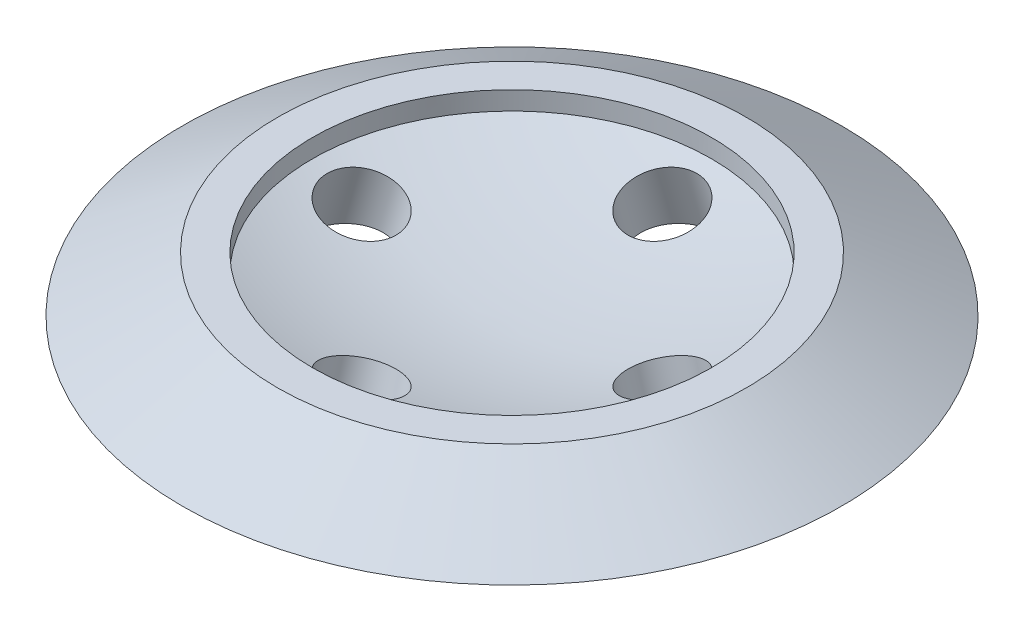
ISO-10303-21;
HEADER;
FILE_DESCRIPTION(('STEP AP214'),'2;1');
FILE_NAME('part.step','',(''),(''),'','','');
FILE_SCHEMA(('AUTOMOTIVE_DESIGN { 1 0 10303 214 1 1 1 1 }'));
ENDSEC;
DATA;
#1=APPLICATION_CONTEXT('core data for automotive mechanical design processes');
#2=APPLICATION_PROTOCOL_DEFINITION('international standard','automotive_design',2000,#1);
#3=PRODUCT_CONTEXT('',#1,'mechanical');
#4=PRODUCT('Part','Part','',(#3));
#5=PRODUCT_RELATED_PRODUCT_CATEGORY('part','',(#4));
#6=PRODUCT_DEFINITION_FORMATION('','',#4);
#7=PRODUCT_DEFINITION_CONTEXT('part definition',#1,'design');
#8=PRODUCT_DEFINITION('design','',#6,#7);
#9=PRODUCT_DEFINITION_SHAPE('','',#8);
#10=(LENGTH_UNIT() NAMED_UNIT(*) SI_UNIT(.MILLI.,.METRE.));
#11=(NAMED_UNIT(*) PLANE_ANGLE_UNIT() SI_UNIT($,.RADIAN.));
#12=(NAMED_UNIT(*) SI_UNIT($,.STERADIAN.) SOLID_ANGLE_UNIT());
#13=UNCERTAINTY_MEASURE_WITH_UNIT(LENGTH_MEASURE(1.E-05),#10,'distance_accuracy_value','');
#14=(GEOMETRIC_REPRESENTATION_CONTEXT(3) GLOBAL_UNCERTAINTY_ASSIGNED_CONTEXT((#13)) GLOBAL_UNIT_ASSIGNED_CONTEXT((#10,
#11,#12)) REPRESENTATION_CONTEXT('',''));
#15=CARTESIAN_POINT('',(0.,0.,0.));
#16=DIRECTION('',(0.,0.,1.));
#17=DIRECTION('',(1.,0.,0.));
#18=AXIS2_PLACEMENT_3D('',#15,#16,#17);
#19=CARTESIAN_POINT('',(0.,0.,-60.));
#20=DIRECTION('',(0.,1.,0.));
#21=DIRECTION('',(0.,0.,1.));
#22=AXIS2_PLACEMENT_3D('',#19,#20,#21);
#23=PLANE('',#22);
#24=CARTESIAN_POINT('',(0.,0.,0.));
#25=DIRECTION('',(0.,1.,0.));
#26=DIRECTION('',(0.,0.,1.));
#27=AXIS2_PLACEMENT_3D('',#24,#25,#26);
#28=CIRCLE('',#27,60.);
#29=CARTESIAN_POINT('',(0.,0.,60.));
#30=VERTEX_POINT('',#29);
#31=EDGE_CURVE('E10',#30,#30,#28,.T.);
#32=ORIENTED_EDGE('',*,*,#31,.F.);
#33=EDGE_LOOP('',(#32));
#34=FACE_BOUND('',#33,.T.);
#35=CARTESIAN_POINT('',(0.,0.,0.));
#36=DIRECTION('',(0.,1.,0.));
#37=DIRECTION('',(0.,0.,1.));
#38=AXIS2_PLACEMENT_3D('',#35,#36,#37);
#39=CIRCLE('',#38,54.);
#40=CARTESIAN_POINT('',(0.,0.,54.));
#41=VERTEX_POINT('',#40);
#42=EDGE_CURVE('E112',#41,#41,#39,.T.);
#43=ORIENTED_EDGE('',*,*,#42,.T.);
#44=EDGE_LOOP('',(#43));
#45=FACE_BOUND('',#44,.T.);
#46=ADVANCED_FACE('F35',(#34,#45),#23,.F.);
#47=CARTESIAN_POINT('',(0.,0.,0.));
#48=DIRECTION('',(0.,-1.,0.));
#49=DIRECTION('',(0.,0.,-1.));
#50=AXIS2_PLACEMENT_3D('',#47,#48,#49);
#51=CONICAL_SURFACE('',#50,60.,1.0471975511966);
#52=CARTESIAN_POINT('',(0.,9.99999999999998,0.));
#53=DIRECTION('',(0.,1.,0.));
#54=DIRECTION('',(0.,0.,1.));
#55=AXIS2_PLACEMENT_3D('',#52,#53,#54);
#56=CIRCLE('',#55,42.6794919243113);
#57=CARTESIAN_POINT('',(0.,9.99999999999997,42.6794919243113));
#58=VERTEX_POINT('',#57);
#59=EDGE_CURVE('E42',#58,#58,#56,.T.);
#60=ORIENTED_EDGE('',*,*,#59,.F.);
#61=EDGE_LOOP('',(#60));
#62=FACE_BOUND('',#61,.T.);
#63=ORIENTED_EDGE('',*,*,#31,.T.);
#64=EDGE_LOOP('',(#63));
#65=FACE_BOUND('',#64,.T.);
#66=ADVANCED_FACE('F128',(#62,#65),#51,.T.);
#67=CARTESIAN_POINT('',(0.,10.,-42.6794919243113));
#68=DIRECTION('',(0.,-1.,0.));
#69=DIRECTION('',(0.,0.,-1.));
#70=AXIS2_PLACEMENT_3D('',#67,#68,#69);
#71=PLANE('',#70);
#72=CARTESIAN_POINT('',(0.,9.99999999999998,0.));
#73=DIRECTION('',(0.,1.,0.));
#74=DIRECTION('',(0.,0.,1.));
#75=AXIS2_PLACEMENT_3D('',#72,#73,#74);
#76=CIRCLE('',#75,36.3261249500886);
#77=CARTESIAN_POINT('',(0.,9.99999999999997,36.3261249500886));
#78=VERTEX_POINT('',#77);
#79=EDGE_CURVE('E47',#78,#78,#76,.T.);
#80=ORIENTED_EDGE('',*,*,#79,.F.);
#81=EDGE_LOOP('',(#80));
#82=FACE_BOUND('',#81,.T.);
#83=ORIENTED_EDGE('',*,*,#59,.T.);
#84=EDGE_LOOP('',(#83));
#85=FACE_BOUND('',#84,.T.);
#86=ADVANCED_FACE('F125',(#82,#85),#71,.F.);
#87=CARTESIAN_POINT('',(0.,23.8695454826544,0.));
#88=DIRECTION('',(0.,1.,0.));
#89=DIRECTION('',(0.,0.,1.));
#90=AXIS2_PLACEMENT_3D('',#87,#88,#89);
#91=CYLINDRICAL_SURFACE('',#90,36.3261249500886);
#92=CARTESIAN_POINT('',(0.,6.63216418099785,0.));
#93=DIRECTION('',(0.,1.,0.));
#94=DIRECTION('',(0.,0.,1.));
#95=AXIS2_PLACEMENT_3D('',#92,#93,#94);
#96=CIRCLE('',#95,36.3261249500886);
#97=CARTESIAN_POINT('',(0.,6.63216418099784,36.3261249500886));
#98=VERTEX_POINT('',#97);
#99=EDGE_CURVE('E118',#98,#98,#96,.T.);
#100=ORIENTED_EDGE('',*,*,#99,.F.);
#101=EDGE_LOOP('',(#100));
#102=FACE_BOUND('',#101,.T.);
#103=ORIENTED_EDGE('',*,*,#79,.T.);
#104=EDGE_LOOP('',(#103));
#105=FACE_BOUND('',#104,.T.);
#106=ADVANCED_FACE('F123',(#102,#105),#91,.F.);
#107=CARTESIAN_POINT('',(0.,102.8,0.));
#108=DIRECTION('',(0.,1.,0.));
#109=DIRECTION('',(0.,0.,-1.));
#110=AXIS2_PLACEMENT_3D('',#107,#108,#109);
#111=SPHERICAL_SURFACE('',#110,102.8);
#112=CARTESIAN_POINT('',(-3.26528690714912,2.42659253956341,21.9626268054432));
#113=CARTESIAN_POINT('',(-3.10738949225978,2.40211015641343,21.8742133677996));
#114=CARTESIAN_POINT('',(-2.94564168176088,2.37940776972178,21.7922280085584));
#115=CARTESIAN_POINT('',(-2.61550575414756,2.33771005146277,21.6416445649212));
#116=CARTESIAN_POINT('',(-2.4471159016714,2.31871569650576,21.5730500073547));
#117=CARTESIAN_POINT('',(-2.10479101583131,2.28456350233241,21.4497157176227));
#118=CARTESIAN_POINT('',(-1.93085117293428,2.26940909834496,21.3949883911138));
#119=CARTESIAN_POINT('',(-1.57873928914634,2.24306131932485,21.2998382424694));
#120=CARTESIAN_POINT('',(-1.40056572369977,2.2318693949668,21.2594206591701));
#121=CARTESIAN_POINT('',(-1.04146916899541,2.21354191419818,21.1932343134807));
#122=CARTESIAN_POINT('',(-0.860548627618744,2.2064029415925,21.1674532141353));
#123=CARTESIAN_POINT('',(-0.497029921059986,2.19621561436636,21.1306635353579));
#124=CARTESIAN_POINT('',(-0.314431161949281,2.19316876888213,21.1196604058958));
#125=CARTESIAN_POINT('',(0.0509659367665492,2.19119289785217,21.1125249063681));
#126=CARTESIAN_POINT('',(0.233764083497001,2.19226133064018,21.116383357536));
#127=CARTESIAN_POINT('',(0.598441205958814,2.19850387645681,21.1389271775827));
#128=CARTESIAN_POINT('',(0.780319817560297,2.20367950459222,21.1576180179941));
#129=CARTESIAN_POINT('',(1.14174669069129,2.21809952630519,21.2096932968307));
#130=CARTESIAN_POINT('',(1.3212955794088,2.22734280040504,21.2430736924681));
#131=CARTESIAN_POINT('',(1.67690387060439,2.24983631662107,21.3243048989119));
#132=CARTESIAN_POINT('',(1.85296196012223,2.26308803703527,21.372161048315));
#133=CARTESIAN_POINT('',(2.20021090906639,2.29349798204332,21.4819809322748));
#134=CARTESIAN_POINT('',(2.37140335457794,2.31065491681239,21.5439400088785));
#135=CARTESIAN_POINT('',(2.70782699025656,2.3487627534568,21.681559318508));
#136=CARTESIAN_POINT('',(2.87305595603701,2.36971505382315,21.7572246019055));
#137=CARTESIAN_POINT('',(3.19625056920159,2.41525202347642,21.9216727120554));
#138=CARTESIAN_POINT('',(3.35421893019861,2.43983532098245,22.0104505849069));
#139=CARTESIAN_POINT('',(3.66189068158555,2.49247409079054,22.2005453314497));
#140=CARTESIAN_POINT('',(3.81159099909894,2.52053084163438,22.3018668223152));
#141=CARTESIAN_POINT('',(4.10155434819067,2.57990269060882,22.516276570178));
#142=CARTESIAN_POINT('',(4.24182086000782,2.61121657616772,22.6293604482534));
#143=CARTESIAN_POINT('',(4.51199670572761,2.67688622716267,22.8665132057844));
#144=CARTESIAN_POINT('',(4.64190219650903,2.71124311143039,22.9905861256253));
#145=CARTESIAN_POINT('',(5.01454324465484,2.81850304524881,23.3779333678799));
#146=CARTESIAN_POINT('',(5.24050812853158,2.89565789222396,23.6565619388908));
#147=CARTESIAN_POINT('',(5.6405634979542,3.05895567486329,24.2462767715757));
#148=CARTESIAN_POINT('',(5.81465406541788,3.14509859633358,24.5573629819929));
#149=CARTESIAN_POINT('',(6.10621657457308,3.32397604356707,25.2033384641121));
#150=CARTESIAN_POINT('',(6.22368620490389,3.4167108382442,25.5382287068939));
#151=CARTESIAN_POINT('',(6.39861180528878,3.60612464150172,26.2222516254887));
#152=CARTESIAN_POINT('',(6.45606770045165,3.70280365500396,26.5713843190741));
#153=CARTESIAN_POINT('',(6.50934951173117,3.8973677152844,27.2740037760856));
#154=CARTESIAN_POINT('',(6.50517358263654,3.99525279808376,27.6274906695566));
#155=CARTESIAN_POINT('',(6.43530210958524,4.18944662446862,28.3287707046447));
#156=CARTESIAN_POINT('',(6.36960658569041,4.28575536856818,28.6765638481187));
#157=CARTESIAN_POINT('',(6.17856069145565,4.47406350117208,29.3565869416781));
#158=CARTESIAN_POINT('',(6.05320990566092,4.56606285965985,29.688816783359));
#159=CARTESIAN_POINT('',(5.74641067445013,4.74313966381113,30.3282789510761));
#160=CARTESIAN_POINT('',(5.56496222562398,4.82821710905387,30.6355112755927));
#161=CARTESIAN_POINT('',(5.15112193234099,4.98903305871264,31.2162502874261));
#162=CARTESIAN_POINT('',(4.91873108766985,5.06477174636376,31.4897576364582));
#163=CARTESIAN_POINT('',(4.40960022163821,5.20476169946217,31.9952884052299));
#164=CARTESIAN_POINT('',(4.1328602105923,5.26901296758115,32.2273118346177));
#165=CARTESIAN_POINT('',(3.54289784305338,5.38420151431117,32.6432789940389));
#166=CARTESIAN_POINT('',(3.22967685110113,5.43513929067126,32.8272245215519));
#167=CARTESIAN_POINT('',(2.57563559495907,5.52225760609864,33.141824318074));
#168=CARTESIAN_POINT('',(2.2348153356812,5.55843814779232,33.2724785965675));
#169=CARTESIAN_POINT('',(1.53526466106944,5.61501347178401,33.4767819363632));
#170=CARTESIAN_POINT('',(1.17653494073507,5.63540886613874,33.5504332079124));
#171=CARTESIAN_POINT('',(0.451336776608304,5.65983703802419,33.6386475242348));
#172=CARTESIAN_POINT('',(0.0848683350721956,5.66386982032551,33.6532105862355));
#173=CARTESIAN_POINT('',(-0.645395110461544,5.65545844373307,33.6228356677283));
#174=CARTESIAN_POINT('',(-1.00919017679057,5.64301467023387,33.5778990789458));
#175=CARTESIAN_POINT('',(-1.72378918367539,5.60200388270677,33.4298020510855));
#176=CARTESIAN_POINT('',(-2.07459311934104,5.57343686260979,33.3266415900911));
#177=CARTESIAN_POINT('',(-2.75325074051901,5.50099181628357,33.0650297690629));
#178=CARTESIAN_POINT('',(-3.08110436151609,5.45711374701576,32.9065782536088));
#179=CARTESIAN_POINT('',(-3.70456136689738,5.35528806835103,32.5388672279935));
#180=CARTESIAN_POINT('',(-4.00016478156647,5.29734047216641,32.3296077655446));
#181=CARTESIAN_POINT('',(-4.55071162644868,5.16903574137639,31.8662751291154));
#182=CARTESIAN_POINT('',(-4.8056539682775,5.09867827469925,31.6122007559473));
#183=CARTESIAN_POINT('',(-5.26773679437821,4.94749030085172,31.0662310525271));
#184=CARTESIAN_POINT('',(-5.47487718244424,4.86665977260384,30.7743356461586));
#185=CARTESIAN_POINT('',(-5.74513918099532,4.73940613508488,30.3147962656973));
#186=CARTESIAN_POINT('',(-5.82852013231636,4.69596114924754,30.1579072607368));
#187=CARTESIAN_POINT('',(-5.98127173671131,4.60735634184234,29.8379363624163));
#188=CARTESIAN_POINT('',(-6.05064754828477,4.56219715897096,29.6748567756182));
#189=CARTESIAN_POINT('',(-6.17491554267926,4.47046582842583,29.3435948058853));
#190=CARTESIAN_POINT('',(-6.22980233744674,4.42389316227594,29.1754105505192));
#191=CARTESIAN_POINT('',(-6.32466192602473,4.3296960022093,28.8352433696536));
#192=CARTESIAN_POINT('',(-6.36464021586877,4.28207190277596,28.663261868827));
#193=CARTESIAN_POINT('',(-6.42943800459197,4.18607428496911,28.3165922468162));
#194=CARTESIAN_POINT('',(-6.45425108239493,4.13770045803083,28.1419030112082));
#195=CARTESIAN_POINT('',(-6.48850992133997,4.04058485279074,27.7911954797026));
#196=CARTESIAN_POINT('',(-6.49796135036181,3.99184321686849,27.6151776980824));
#197=CARTESIAN_POINT('',(-6.50144776973854,3.89430467105392,27.2629422208417));
#198=CARTESIAN_POINT('',(-6.4954776717194,3.84550774822926,27.0867244784184));
#199=CARTESIAN_POINT('',(-6.46815784018241,3.74823970891758,26.7354652601936));
#200=CARTESIAN_POINT('',(-6.44681378429278,3.69976847881968,26.5604233742261));
#201=CARTESIAN_POINT('',(-6.3888958569247,3.60346458624643,26.2126453366367));
#202=CARTESIAN_POINT('',(-6.35231773131354,3.55563210599649,26.0399098429945));
#203=CARTESIAN_POINT('',(-6.26420758530123,3.46097715800262,25.6980859892437));
#204=CARTESIAN_POINT('',(-6.21268108684683,3.41415432414342,25.5289963071026));
#205=CARTESIAN_POINT('',(-6.09499853875623,3.32180455306967,25.1954965004729));
#206=CARTESIAN_POINT('',(-6.02883346814038,3.27627843456448,25.0310893323949));
#207=CARTESIAN_POINT('',(-5.88238984820189,3.18689270213529,24.7082929454892));
#208=CARTESIAN_POINT('',(-5.80211650993373,3.14303248014199,24.5499015308509));
#209=CARTESIAN_POINT('',(-5.62793732619961,3.05723675977106,24.2400691816884));
#210=CARTESIAN_POINT('',(-5.53402016537821,3.01530289736869,24.0886341549321));
#211=CARTESIAN_POINT('',(-5.33330962789378,2.93371270384902,23.7939887031489));
#212=CARTESIAN_POINT('',(-5.22652097195217,2.89405554556306,23.6507752910579));
#213=CARTESIAN_POINT('',(-5.00089740895623,2.81731798057746,23.3736536761061));
#214=CARTESIAN_POINT('',(-4.88207332131386,2.78023530918344,23.2397372949445));
#215=CARTESIAN_POINT('',(-4.63318841907888,2.70888308200576,22.9820633596961));
#216=CARTESIAN_POINT('',(-4.50313056864809,2.67461278876864,22.8583031424901));
#217=CARTESIAN_POINT('',(-4.19896436644311,2.60095667800861,22.5923088823569));
#218=CARTESIAN_POINT('',(-4.02194942853555,2.5624208902837,22.4531445132187));
#219=CARTESIAN_POINT('',(-3.65372097192077,2.490528586849,22.1935195354612));
#220=CARTESIAN_POINT('',(-3.46250745334205,2.45717207109233,22.0730589266726));
#221=CARTESIAN_POINT('',(-3.26528690714912,2.42659253956341,21.9626268054432));
#222=B_SPLINE_CURVE_WITH_KNOTS('',3,(#112,#113,#114,#115,#116,#117,#118,#119,#120,#121,#122,
#123,#124,#125,#126,#127,#128,#129,#130,#131,#132,#133,#134,#135,#136,#137,#138,#139,#140,#141,
#142,#143,#144,#145,#146,#147,#148,#149,#150,#151,#152,#153,#154,#155,#156,#157,#158,#159,#160,
#161,#162,#163,#164,#165,#166,#167,#168,#169,#170,#171,#172,#173,#174,#175,#176,#177,#178,#179,
#180,#181,#182,#183,#184,#185,#186,#187,#188,#189,#190,#191,#192,#193,#194,#195,#196,#197,#198,
#199,#200,#201,#202,#203,#204,#205,#206,#207,#208,#209,#210,#211,#212,#213,#214,#215,#216,#217,
#218,#219,#220,#221),.UNSPECIFIED.,.T.,.F.,(4,2,2,2,2,2,2,2,2,2,2,2,2,2,2,2,2,2,2,2,2,2,2,2,2,2,
2,2,2,2,2,2,2,2,2,2,2,2,2,2,2,2,2,2,2,2,2,2,2,2,2,2,2,2,4),(0.,0.547643134037494,
1.09543031066958,1.64370582243297,2.19218185230326,2.74019488785095,3.2884099697712,
3.83628651898708,4.38436526885067,4.93229327339165,5.48042359834341,6.0283731473473,
6.57652501337938,7.12447031632896,7.67261791525405,8.2205621743059,8.7687087412715,
9.86386325592623,10.9590160411489,12.0542135285425,13.149412382633,14.2446440262345,
15.3398753126757,16.4351142267049,17.5303532073123,18.6255706948935,19.7207879277532,
20.8159642080706,21.911140293476,23.0062739121595,24.1014072115516,25.1965148957016,
26.2916229920704,27.386734166756,28.4818443130576,29.5769837675067,30.6721254260058,
31.220305458421,31.7682832103326,32.3164644534438,32.864443408808,33.4126542225475,
33.9606627208352,34.5088520590852,35.0568390538293,35.6049791773295,36.1529170744804,
36.7011935820627,37.2492680012482,37.7977995826722,38.3461305945244,38.8939729796016,
39.4416712489828,40.1257006807937,40.809730106414),.UNSPECIFIED.);
#223=CARTESIAN_POINT('',(-3.26528690714912,2.42659253956341,21.9626268054432));
#224=VERTEX_POINT('',#223);
#225=EDGE_CURVE('E61',#224,#224,#222,.T.);
#226=ORIENTED_EDGE('',*,*,#225,.T.);
#227=EDGE_LOOP('',(#226));
#228=FACE_BOUND('',#227,.T.);
#229=CARTESIAN_POINT('',(-32.4072315263735,5.31883586224063,-3.87736806909515));
#230=CARTESIAN_POINT('',(-32.302241190766,5.28976221353437,-4.02394210833562));
#231=CARTESIAN_POINT('',(-32.1913055438153,5.25904221960009,-4.16590414123954));
#232=CARTESIAN_POINT('',(-31.9582737931682,5.19451174742294,-4.43967960348603));
#233=CARTESIAN_POINT('',(-31.8361747595524,5.16070045784506,-4.57149035172341));
#234=CARTESIAN_POINT('',(-31.5816019986341,5.09020499606023,-4.82408579356474));
#235=CARTESIAN_POINT('',(-31.4491191121878,5.05351828757211,-4.94486054475947));
#236=CARTESIAN_POINT('',(-31.1747645213773,4.9775450040126,-5.17443752364972));
#237=CARTESIAN_POINT('',(-31.03288940067,4.93825748291847,-5.28323535610129));
#238=CARTESIAN_POINT('',(-30.7409283973175,4.85740880714782,-5.48794540986753));
#239=CARTESIAN_POINT('',(-30.5908495690693,4.81584960589782,-5.5838684643855));
#240=CARTESIAN_POINT('',(-30.2833813880843,4.73070686918128,-5.76228892057738));
#241=CARTESIAN_POINT('',(-30.1259893604685,4.6871225930226,-5.84478135937874));
#242=CARTESIAN_POINT('',(-29.8051651662672,4.59828150447656,-5.99566427277613));
#243=CARTESIAN_POINT('',(-29.6417367901571,4.55302574168614,-6.06406342539554));
#244=CARTESIAN_POINT('',(-29.309847999314,4.46112084515094,-6.186360593262));
#245=CARTESIAN_POINT('',(-29.1413857496592,4.41447120331683,-6.24025324723244));
#246=CARTESIAN_POINT('',(-28.8007250777143,4.32013739898925,-6.33310997439621));
#247=CARTESIAN_POINT('',(-28.6285275501442,4.27245348423786,-6.37207758179571));
#248=CARTESIAN_POINT('',(-28.2815172060956,4.17636152649942,-6.43483708103586));
#249=CARTESIAN_POINT('',(-28.1067034473865,4.12795322262573,-6.4586233638473));
#250=CARTESIAN_POINT('',(-27.7558239759834,4.0307900163092,-6.49082290958399));
#251=CARTESIAN_POINT('',(-27.579758694971,3.98203523337696,-6.49924123739254));
#252=CARTESIAN_POINT('',(-27.2275054795002,3.88449178708865,-6.50066096110765));
#253=CARTESIAN_POINT('',(-27.0513175237577,3.83570311786967,-6.49365666358081));
#254=CARTESIAN_POINT('',(-26.7002006484859,3.738474506077,-6.46427397647715));
#255=CARTESIAN_POINT('',(-26.5252712907189,3.69003444211903,-6.44190122880374));
#256=CARTESIAN_POINT('',(-26.177788804969,3.59381240230999,-6.38193806134356));
#257=CARTESIAN_POINT('',(-26.0052365781434,3.54603067603031,-6.34434202618814));
#258=CARTESIAN_POINT('',(-25.663851393656,3.45149721123566,-6.25420626593448));
#259=CARTESIAN_POINT('',(-25.4950170797245,3.40474509712461,-6.20167209083262));
#260=CARTESIAN_POINT('',(-25.1621909721336,3.31258189094392,-6.08204265949391));
#261=CARTESIAN_POINT('',(-24.9982009893377,3.26717130034998,-6.01494203449152));
#262=CARTESIAN_POINT('',(-24.5154032269211,3.13347950968723,-5.79248332076841));
#263=CARTESIAN_POINT('',(-24.205395403292,3.04763521602704,-5.61586974186706));
#264=CARTESIAN_POINT('',(-23.6185307479941,2.88512669601531,-5.21123153279947));
#265=CARTESIAN_POINT('',(-23.3416738522197,2.80846245191183,-4.98320700205171));
#266=CARTESIAN_POINT('',(-22.8287463638095,2.66642823491103,-4.48214663472423));
#267=CARTESIAN_POINT('',(-22.592674590627,2.60105793510451,-4.20911210143005));
#268=CARTESIAN_POINT('',(-22.1680722624976,2.48348201695689,-3.62579843509894));
#269=CARTESIAN_POINT('',(-21.9795417474893,2.43127640967519,-3.31551927077382));
#270=CARTESIAN_POINT('',(-21.6553655449328,2.34150948656527,-2.66653229248584));
#271=CARTESIAN_POINT('',(-21.5197177065485,2.30394757515093,-2.3278256354026));
#272=CARTESIAN_POINT('',(-21.3051521575157,2.24453277696443,-1.63158954936942));
#273=CARTESIAN_POINT('',(-21.2262344121672,2.22267988058357,-1.27406013193291));
#274=CARTESIAN_POINT('',(-21.1273703609794,2.1953037097496,-0.550340060146471));
#275=CARTESIAN_POINT('',(-21.1074220772708,2.18977988761003,-0.184149696704889));
#276=CARTESIAN_POINT('',(-21.1270580676958,2.19521723432261,0.546508450718382));
#277=CARTESIAN_POINT('',(-21.1666423432648,2.20617840357227,0.910976234658533));
#278=CARTESIAN_POINT('',(-21.3042185302783,2.24427425211291,1.62783841738309));
#279=CARTESIAN_POINT('',(-21.4022097252962,2.27140873302007,1.98023296420325));
#280=CARTESIAN_POINT('',(-21.6538168785282,2.34108065353507,2.66295028696769));
#281=CARTESIAN_POINT('',(-21.8074328364751,2.38361809306892,2.993273063018));
#282=CARTESIAN_POINT('',(-22.1659307245271,2.48288901393129,3.62247542887325));
#283=CARTESIAN_POINT('',(-22.3708134029773,2.53962270248382,3.92135455960184));
#284=CARTESIAN_POINT('',(-22.8260269322596,2.66567520674316,4.47918101047509));
#285=CARTESIAN_POINT('',(-23.0763577928392,2.73499402514915,4.73812832205537));
#286=CARTESIAN_POINT('',(-23.6153707423388,2.88425166718619,5.20875023027889));
#287=CARTESIAN_POINT('',(-23.9040541752259,2.96419086298097,5.42042316961641));
#288=CARTESIAN_POINT('',(-24.5115704963253,3.13241819207848,5.79047729984954));
#289=CARTESIAN_POINT('',(-24.8304033873566,3.22070632616179,5.94885848576258));
#290=CARTESIAN_POINT('',(-25.4891813444104,3.40312908058503,6.20783992216977));
#291=CARTESIAN_POINT('',(-25.8291272526834,3.49726393416504,6.30843786590494));
#292=CARTESIAN_POINT('',(-26.5204710559868,3.68870515855389,6.44898727588059));
#293=CARTESIAN_POINT('',(-26.871868957722,3.78601153121956,6.48893870661375));
#294=CARTESIAN_POINT('',(-27.5761484535123,3.98103546859981,6.50706480273183));
#295=CARTESIAN_POINT('',(-27.9290300886328,4.07875304469538,6.48523774687845));
#296=CARTESIAN_POINT('',(-28.6262626245415,4.27182625304168,6.38041027216925));
#297=CARTESIAN_POINT('',(-28.9706135338417,4.36718188764918,6.29740991435538));
#298=CARTESIAN_POINT('',(-29.6409626262811,4.55281132583853,6.07263739695466));
#299=CARTESIAN_POINT('',(-29.966960761964,4.64308511627981,5.93086508540393));
#300=CARTESIAN_POINT('',(-30.591528405491,4.81603755274134,5.59239963419346));
#301=CARTESIAN_POINT('',(-30.8900978663655,4.89871618575543,5.39570640048796));
#302=CARTESIAN_POINT('',(-31.3106679887659,5.01517889303084,5.0640299094015));
#303=CARTESIAN_POINT('',(-31.4463746434511,5.05275829967639,4.94729417064442));
#304=CARTESIAN_POINT('',(-31.7078201991124,5.12515692226321,4.70239260311135));
#305=CARTESIAN_POINT('',(-31.8335627609234,5.15997715193355,4.57423100934762));
#306=CARTESIAN_POINT('',(-32.0742307909159,5.22662221400253,4.30733058847308));
#307=CARTESIAN_POINT('',(-32.1891522274242,5.25844592997716,4.16858785367304));
#308=CARTESIAN_POINT('',(-32.4072823645715,5.3188499349041,3.88159909080615));
#309=CARTESIAN_POINT('',(-32.5104953729908,5.34743141674346,3.73335658952605));
#310=CARTESIAN_POINT('',(-32.7045538127721,5.40116960671161,3.42832453903264));
#311=CARTESIAN_POINT('',(-32.7953949129148,5.42632511545865,3.27153202335146));
#312=CARTESIAN_POINT('',(-32.9639905967301,5.47301226232038,2.95062129130702));
#313=CARTESIAN_POINT('',(-33.0417499988874,5.49454523475228,2.78650580057881));
#314=CARTESIAN_POINT('',(-33.1836934663127,5.53385193832392,2.45200653631461));
#315=CARTESIAN_POINT('',(-33.2478730466396,5.5516244275073,2.28162071364904));
#316=CARTESIAN_POINT('',(-33.362146839944,5.58326891980986,1.93590762394252));
#317=CARTESIAN_POINT('',(-33.4122462439995,5.59714236042988,1.76058220433054));
#318=CARTESIAN_POINT('',(-33.4980447795114,5.62090154722643,1.40613547568713));
#319=CARTESIAN_POINT('',(-33.5337406434164,5.63078638855921,1.22701331502599));
#320=CARTESIAN_POINT('',(-33.590451472852,5.64649066199442,0.866351980298578));
#321=CARTESIAN_POINT('',(-33.6114718503501,5.65231159276959,0.684813722425993));
#322=CARTESIAN_POINT('',(-33.6387120265798,5.65985490094882,0.320432512257835));
#323=CARTESIAN_POINT('',(-33.6449226724795,5.66157474376481,0.137588823137295));
#324=CARTESIAN_POINT('',(-33.6424729481313,5.66089636980025,-0.227923669368204));
#325=CARTESIAN_POINT('',(-33.6338180579619,5.65849967055489,-0.410592512372372));
#326=CARTESIAN_POINT('',(-33.6016958950573,5.64960445025143,-0.774675037155025));
#327=CARTESIAN_POINT('',(-33.5782163966347,5.64310254367513,-0.956087557901235));
#328=CARTESIAN_POINT('',(-33.5166128319151,5.62604338251944,-1.31614608872098));
#329=CARTESIAN_POINT('',(-33.4784941229889,5.61548761149375,-1.49479308601465));
#330=CARTESIAN_POINT('',(-33.3879213814368,5.59040636128803,-1.84796318692077));
#331=CARTESIAN_POINT('',(-33.3354801536128,5.57588442798725,-2.02248982356485));
#332=CARTESIAN_POINT('',(-33.2166429821426,5.54297625659462,-2.36628639551912));
#333=CARTESIAN_POINT('',(-33.1502507130844,5.52459103606046,-2.53555770159151));
#334=CARTESIAN_POINT('',(-32.9857524173831,5.47903849932502,-2.90904941179527));
#335=CARTESIAN_POINT('',(-32.8838656987217,5.45082424547868,-3.11149023418443));
#336=CARTESIAN_POINT('',(-32.6601529569824,5.38887422535602,-3.50414026660258));
#337=CARTESIAN_POINT('',(-32.5383269340821,5.35513845912891,-3.69434947674057));
#338=CARTESIAN_POINT('',(-32.4072315263735,5.31883586224063,-3.87736806909515));
#339=B_SPLINE_CURVE_WITH_KNOTS('',3,(#229,#230,#231,#232,#233,#234,#235,#236,#237,#238,#239,
#240,#241,#242,#243,#244,#245,#246,#247,#248,#249,#250,#251,#252,#253,#254,#255,#256,#257,#258,
#259,#260,#261,#262,#263,#264,#265,#266,#267,#268,#269,#270,#271,#272,#273,#274,#275,#276,#277,
#278,#279,#280,#281,#282,#283,#284,#285,#286,#287,#288,#289,#290,#291,#292,#293,#294,#295,#296,
#297,#298,#299,#300,#301,#302,#303,#304,#305,#306,#307,#308,#309,#310,#311,#312,#313,#314,#315,
#316,#317,#318,#319,#320,#321,#322,#323,#324,#325,#326,#327,#328,#329,#330,#331,#332,#333,#334,
#335,#336,#337,#338),.UNSPECIFIED.,.T.,.F.,(4,2,2,2,2,2,2,2,2,2,2,2,2,2,2,2,2,2,2,2,2,2,2,2,2,2,
2,2,2,2,2,2,2,2,2,2,2,2,2,2,2,2,2,2,2,2,2,2,2,2,2,2,2,2,4),(0.,0.54767831488969,
1.09550078719962,1.64381202862507,2.19232382111889,2.74037114749618,3.28862053058173,
3.83653131033066,4.38464430845279,4.93262743470218,5.48081290671881,6.02881767824254,
6.57702478572949,7.12503074868097,7.67323903736996,8.22124391468849,8.76945111447354,
9.86468467721383,10.9599161220098,12.055115859439,13.1503165169221,14.2454726259267,
15.3406280650585,16.4357467716357,17.5308655046197,18.6259708050186,19.7210761001572,
20.8161973815849,21.9113188978883,23.006478800029,24.1016388045628,25.1968425258306,
26.2920468883182,27.3872817650891,28.4825155489783,29.5777521647803,30.6729906560603,
31.2211848177494,31.7691766284751,32.31737180564,32.8653646314312,33.4135488108336,
33.9615306290588,34.5096931450392,35.0576532986048,35.605737691257,36.153619856614,
36.7018405409481,37.2498591708353,37.7983303368768,38.3466009751862,38.8943830371004,
39.4420209982249,40.1258754902406,40.8097299761622),.UNSPECIFIED.);
#340=CARTESIAN_POINT('',(-32.4072315263735,5.31883586224063,-3.87736806909515));
#341=VERTEX_POINT('',#340);
#342=EDGE_CURVE('E58',#341,#341,#339,.T.);
#343=ORIENTED_EDGE('',*,*,#342,.T.);
#344=EDGE_LOOP('',(#343));
#345=FACE_BOUND('',#344,.T.);
#346=CARTESIAN_POINT('',(-3.87736806909525,5.31883586224063,-32.4072315263735));
#347=CARTESIAN_POINT('',(-3.73080380909474,5.34790844295963,-32.5122180049413));
#348=CARTESIAN_POINT('',(-3.57966257582688,5.37532801563928,-32.6112351115184));
#349=CARTESIAN_POINT('',(-3.26921783573979,5.42668312518392,-32.7966877535986));
#350=CARTESIAN_POINT('',(-3.10991219259653,5.45061774380746,-32.8831199731427));
#351=CARTESIAN_POINT('',(-2.78417216068641,5.49484137284637,-33.0428194070602));
#352=CARTESIAN_POINT('',(-2.61773154368639,5.51512711441215,-33.116074816978));
#353=CARTESIAN_POINT('',(-2.27897364747867,5.55188978795977,-33.2488313113104));
#354=CARTESIAN_POINT('',(-2.10665424130921,5.56836532426356,-33.30832735567));
#355=CARTESIAN_POINT('',(-1.75757182647595,5.59736827786198,-33.4130620726124));
#356=CARTESIAN_POINT('',(-1.58081269013709,5.60989901494991,-33.4583127335693));
#357=CARTESIAN_POINT('',(-1.22390140587528,5.63094610360638,-33.53431740303));
#358=CARTESIAN_POINT('',(-1.04374803101184,5.63946097340985,-33.5650660606193));
#359=CARTESIAN_POINT('',(-0.681505454662926,5.65240486626252,-33.6118086774939));
#360=CARTESIAN_POINT('',(-0.499417517294409,5.65683640917051,-33.6278117364245));
#361=CARTESIAN_POINT('',(-0.134422598967604,5.66159208034435,-33.6449852779107));
#362=CARTESIAN_POINT('',(0.0484846594656455,5.66191469212373,-33.6461502841744));
#363=CARTESIAN_POINT('',(0.413699339046012,5.65844677853835,-33.633627055409));
#364=CARTESIAN_POINT('',(0.596006914234066,5.65465740835383,-33.6199429919332));
#365=CARTESIAN_POINT('',(0.958845435053423,5.64299213847457,-33.5778177040421));
#366=CARTESIAN_POINT('',(1.13937569981332,5.63511473035804,-33.5493710324564));
#367=CARTESIAN_POINT('',(1.49724818750609,5.6153318146763,-33.4779315138681));
#368=CARTESIAN_POINT('',(1.67459144235711,5.6034276366163,-33.4349434679425));
#369=CARTESIAN_POINT('',(2.02495532808646,5.57567013476923,-33.3347063013496));
#370=CARTESIAN_POINT('',(2.19797433877428,5.55981535448789,-33.2774519210199));
#371=CARTESIAN_POINT('',(2.53832618712809,5.52427826963975,-33.1491212564937));
#372=CARTESIAN_POINT('',(2.70566119310325,5.50459744432404,-33.0780503141488));
#373=CARTESIAN_POINT('',(3.03358378292973,5.46153727025438,-32.9225523435129));
#374=CARTESIAN_POINT('',(3.19416885290078,5.43815655872962,-32.838120393992));
#375=CARTESIAN_POINT('',(3.50733646761687,5.3878738762712,-32.6565405069374));
#376=CARTESIAN_POINT('',(3.65992195916009,5.36097321492694,-32.5593972985987));
#377=CARTESIAN_POINT('',(3.95608503115968,5.30383810461778,-32.3530718555335));
#378=CARTESIAN_POINT('',(4.09965926499246,5.27360242844746,-32.2438851891033));
#379=CARTESIAN_POINT('',(4.51518088512189,5.17822005353629,-31.8994414383566));
#380=CARTESIAN_POINT('',(4.77225834668207,5.10834472848428,-31.6471081993129));
#381=CARTESIAN_POINT('',(5.23866141273724,4.95810472489968,-31.1045618694045));
#382=CARTESIAN_POINT('',(5.44798709324832,4.87774006306539,-30.8143488388418));
#383=CARTESIAN_POINT('',(5.81316147299119,4.70876030474178,-30.2041278293182));
#384=CARTESIAN_POINT('',(5.96900802293214,4.62014487684154,-29.8841186535269));
#385=CARTESIAN_POINT('',(6.22273417999867,4.43719220280194,-29.2234364848268));
#386=CARTESIAN_POINT('',(6.32061371358703,4.34285494940401,-28.8827634657044));
#387=CARTESIAN_POINT('',(6.45564519733039,4.15113034833816,-28.1904016509594));
#388=CARTESIAN_POINT('',(6.49279501027636,4.05374289345003,-27.8387124680984));
#389=CARTESIAN_POINT('',(6.5053021073793,3.85868632338111,-27.134315730942));
#390=CARTESIAN_POINT('',(6.480659408878,3.76101720827938,-26.7816081769326));
#391=CARTESIAN_POINT('',(6.37028105183139,3.5681679908512,-26.0851803341416));
#392=CARTESIAN_POINT('',(6.28454442834658,3.47298792786237,-25.7414601873994));
#393=CARTESIAN_POINT('',(6.05441011090309,3.28782037935807,-25.0727705756755));
#394=CARTESIAN_POINT('',(5.91001241044759,3.19783289441769,-24.7478011127705));
#395=CARTESIAN_POINT('',(5.56665624229722,3.02560607230546,-24.12584195974));
#396=CARTESIAN_POINT('',(5.36769838164,2.94336664894217,-23.8288519583636));
#397=CARTESIAN_POINT('',(4.92086829474946,2.78896958256859,-23.2712794180391));
#398=CARTESIAN_POINT('',(4.67299607831076,2.71681193753953,-23.0106968718006));
#399=CARTESIAN_POINT('',(4.1353822142234,2.5846292797714,-22.5333457840002));
#400=CARTESIAN_POINT('',(3.84564194800837,2.52460386688679,-22.3165757974114));
#401=CARTESIAN_POINT('',(3.23251050103116,2.41838693839548,-21.9329939083154));
#402=CARTESIAN_POINT('',(2.9091193262414,2.37219542033353,-21.7661819969416));
#403=CARTESIAN_POINT('',(2.23788024106941,2.29495939748024,-21.4872585881251));
#404=CARTESIAN_POINT('',(1.89003331913557,2.26391428090632,-21.3751448813517));
#405=CARTESIAN_POINT('',(1.17974577694811,2.21784977510783,-21.2087913773285));
#406=CARTESIAN_POINT('',(0.817305161406765,2.20283038070862,-21.1545515613914));
#407=CARTESIAN_POINT('',(0.0881307318145102,2.18924389566731,-21.1054864395371));
#408=CARTESIAN_POINT('',(-0.278602951889149,2.19067630679886,-21.1106593343658));
#409=CARTESIAN_POINT('',(-1.00596446400482,2.20995186025188,-21.1802694894824));
#410=CARTESIAN_POINT('',(-1.36659229041875,2.2277950079435,-21.2447067691637));
#411=CARTESIAN_POINT('',(-2.07150006712701,2.27938414139575,-21.4310114235617));
#412=CARTESIAN_POINT('',(-2.41578012035317,2.31313002701205,-21.552878436626));
#413=CARTESIAN_POINT('',(-3.07823110068871,2.39557066063901,-21.8505972479387));
#414=CARTESIAN_POINT('',(-3.39640205349979,2.44426539393387,-22.0264489930439));
#415=CARTESIAN_POINT('',(-3.99757584271057,2.55520676770376,-22.4270921689841));
#416=CARTESIAN_POINT('',(-4.28057799548438,2.61745367154687,-22.6518845509141));
#417=CARTESIAN_POINT('',(-4.8035034995021,2.75379023626775,-23.1442364352261));
#418=CARTESIAN_POINT('',(-5.04342676499706,2.82787992071815,-23.4117960227345));
#419=CARTESIAN_POINT('',(-5.36565522559567,2.94619952272116,-23.8390821824626));
#420=CARTESIAN_POINT('',(-5.46683425223389,2.98686143128445,-23.9859239453358));
#421=CARTESIAN_POINT('',(-5.65599483775002,3.0703102166912,-24.2872811104405));
#422=CARTESIAN_POINT('',(-5.7439812527312,3.11309630388244,-24.4417936610964));
#423=CARTESIAN_POINT('',(-5.90615896692877,3.20050774162215,-24.7574606068912));
#424=CARTESIAN_POINT('',(-5.9803451312127,3.24513376927859,-24.9186174471637));
#425=CARTESIAN_POINT('',(-6.11434238241797,3.3358792011781,-25.2463238534617));
#426=CARTESIAN_POINT('',(-6.17415876373711,3.3819980482787,-25.4128714075916));
#427=CARTESIAN_POINT('',(-6.27904585404326,3.47543617504046,-25.7503013171036));
#428=CARTESIAN_POINT('',(-6.3241102603447,3.52275595851478,-25.9211854917695));
#429=CARTESIAN_POINT('',(-6.39912500251277,3.61822303832783,-26.2659419145499));
#430=CARTESIAN_POINT('',(-6.42908090987527,3.66637002284032,-26.4398130366859));
#431=CARTESIAN_POINT('',(-6.47369796106809,3.76318230579808,-26.7894267422522));
#432=CARTESIAN_POINT('',(-6.48835405416582,3.81184777005004,-26.9651699243529));
#433=CARTESIAN_POINT('',(-6.50224729870482,3.90931725873545,-27.3171563608607));
#434=CARTESIAN_POINT('',(-6.50149013925597,3.95812122539669,-27.4933994067499));
#435=CARTESIAN_POINT('',(-6.48457375111062,4.05555284095722,-27.8452484686817));
#436=CARTESIAN_POINT('',(-6.46841009602906,4.10418043515305,-28.0208542870896));
#437=CARTESIAN_POINT('',(-6.42079801325072,4.20088153978076,-28.3700646982368));
#438=CARTESIAN_POINT('',(-6.3893552265711,4.24895524800551,-28.5436700053631));
#439=CARTESIAN_POINT('',(-6.31138656285447,4.34425476568948,-28.8878183727732));
#440=CARTESIAN_POINT('',(-6.26485137651235,4.39148003278892,-29.0583594742922));
#441=CARTESIAN_POINT('',(-6.15705435004967,4.48469890250971,-29.3949935846414));
#442=CARTESIAN_POINT('',(-6.09579794414122,4.5306929526775,-29.5610882097638));
#443=CARTESIAN_POINT('',(-5.95892684027759,4.62117875269992,-29.8878520661941));
#444=CARTESIAN_POINT('',(-5.88330008180738,4.66566920342903,-30.0485166058574));
#445=CARTESIAN_POINT('',(-5.71829125741534,4.75277406616477,-30.3630706704247));
#446=CARTESIAN_POINT('',(-5.62891423104227,4.79538915817114,-30.51696265104));
#447=CARTESIAN_POINT('',(-5.43710330538777,4.87842102632605,-30.8168078208224));
#448=CARTESIAN_POINT('',(-5.33468111162387,4.91883972748548,-30.9627679617963));
#449=CARTESIAN_POINT('',(-5.11748449609768,4.9972196033779,-31.2458134262051));
#450=CARTESIAN_POINT('',(-5.00271333068309,5.03518142176779,-31.3829010740659));
#451=CARTESIAN_POINT('',(-4.73155629459378,5.11751289977965,-31.6802161692418));
#452=CARTESIAN_POINT('',(-4.57192333741013,5.16112520683601,-31.837708620362));
#453=CARTESIAN_POINT('',(-4.23636321026827,5.24362994789293,-32.1356489441919));
#454=CARTESIAN_POINT('',(-4.06043604037881,5.28252238191341,-32.2760968169735));
#455=CARTESIAN_POINT('',(-3.87736806909525,5.31883586224063,-32.4072315263735));
#456=B_SPLINE_CURVE_WITH_KNOTS('',3,(#346,#347,#348,#349,#350,#351,#352,#353,#354,#355,#356,
#357,#358,#359,#360,#361,#362,#363,#364,#365,#366,#367,#368,#369,#370,#371,#372,#373,#374,#375,
#376,#377,#378,#379,#380,#381,#382,#383,#384,#385,#386,#387,#388,#389,#390,#391,#392,#393,#394,
#395,#396,#397,#398,#399,#400,#401,#402,#403,#404,#405,#406,#407,#408,#409,#410,#411,#412,#413,
#414,#415,#416,#417,#418,#419,#420,#421,#422,#423,#424,#425,#426,#427,#428,#429,#430,#431,#432,
#433,#434,#435,#436,#437,#438,#439,#440,#441,#442,#443,#444,#445,#446,#447,#448,#449,#450,#451,
#452,#453,#454,#455),.UNSPECIFIED.,.T.,.F.,(4,2,2,2,2,2,2,2,2,2,2,2,2,2,2,2,2,2,2,2,2,2,2,2,2,2,
2,2,2,2,2,2,2,2,2,2,2,2,2,2,2,2,2,2,2,2,2,2,2,2,2,2,2,2,4),(0.,0.547647577335201,
1.09543919278423,1.64371912989563,2.19219958494317,2.7402172180477,3.28843689949412,
3.83631804248276,4.3844013865443,4.93233079725264,5.48046252920855,6.02841346269345,
6.57656671249829,7.12450845160588,7.67265248464893,8.22059315873102,8.76873613876367,
9.86387667624631,10.959015470362,12.0541982722275,13.1493824634441,14.24460519571,
15.3398276206075,16.4350673442263,17.530307189145,18.6255348488934,19.7207622893333,
20.8159536010615,21.9111447184136,23.0062915959292,24.1014381198255,25.1965514783992,
26.2916651953312,27.3867720160942,28.4818777588257,29.5770047853531,30.6721339917175,
31.220306488145,31.7682767083235,32.3164504165639,32.8644218450498,33.4126270861392,
33.9606300198692,34.5088138016679,35.0567952497163,35.6049341838225,36.1528708999844,
36.701146239727,37.2492194983659,37.7977547830169,38.3460895033157,38.893935620493,
39.4416376264408,40.1256838692543,40.8097301091818),.UNSPECIFIED.);
#457=CARTESIAN_POINT('',(-3.87736806909525,5.31883586224063,-32.4072315263735));
#458=VERTEX_POINT('',#457);
#459=EDGE_CURVE('E55',#458,#458,#456,.T.);
#460=ORIENTED_EDGE('',*,*,#459,.T.);
#461=EDGE_LOOP('',(#460));
#462=FACE_BOUND('',#461,.T.);
#463=CARTESIAN_POINT('',(21.5376786216275,2.30892109358101,-2.3476498493941));
#464=CARTESIAN_POINT('',(21.601245848674,2.32652333931009,-2.51794213842479));
#465=CARTESIAN_POINT('',(21.6717273214848,2.34604019728988,-2.68543244287611));
#466=CARTESIAN_POINT('',(21.8260523774513,2.38877400129751,-3.01371611000716));
#467=CARTESIAN_POINT('',(21.9098994724716,2.41199191979213,-3.17450769853065));
#468=CARTESIAN_POINT('',(22.0904236784092,2.46198051255099,-3.48833100268621));
#469=CARTESIAN_POINT('',(22.1871121680556,2.48875433769573,-3.6413556678972));
#470=CARTESIAN_POINT('',(22.3926119129902,2.54565891030508,-3.93846040453356));
#471=CARTESIAN_POINT('',(22.5014275893511,2.57579088201164,-4.08253718392391));
#472=CARTESIAN_POINT('',(22.7302806405141,2.63916224505775,-4.36054047561303));
#473=CARTESIAN_POINT('',(22.8503084353441,2.67239898359116,-4.49447547933193));
#474=CARTESIAN_POINT('',(23.100856650271,2.74177800413967,-4.75142589282108));
#475=CARTESIAN_POINT('',(23.2313809225248,2.77792135286684,-4.87443725849681));
#476=CARTESIAN_POINT('',(23.5018712390183,2.85282261374235,-5.1085374432414));
#477=CARTESIAN_POINT('',(23.6418314024675,2.89157889741483,-5.2196335784686));
#478=CARTESIAN_POINT('',(23.9303242974234,2.97146534756635,-5.42923996720109));
#479=CARTESIAN_POINT('',(24.0788601737767,3.01259638490435,-5.52774556045299));
#480=CARTESIAN_POINT('',(24.3833654762098,3.09691694690815,-5.71140093478084));
#481=CARTESIAN_POINT('',(24.5393331464084,3.14010598533803,-5.7965538504415));
#482=CARTESIAN_POINT('',(24.8576848573431,3.22826089053968,-5.95295571553397));
#483=CARTESIAN_POINT('',(25.0200712460719,3.27322740752037,-6.02419951928636));
#484=CARTESIAN_POINT('',(25.3499970123034,3.36458743456282,-6.15221625619844));
#485=CARTESIAN_POINT('',(25.5175346737464,3.41098046940443,-6.20899395119984));
#486=CARTESIAN_POINT('',(25.8566858051294,3.50489525433377,-6.30772409994728));
#487=CARTESIAN_POINT('',(26.0283007571314,3.55241741484993,-6.34967107206012));
#488=CARTESIAN_POINT('',(26.3742663576272,3.64821936395178,-6.41839977719786));
#489=CARTESIAN_POINT('',(26.548616021767,3.69649887992958,-6.4451868438521));
#490=CARTESIAN_POINT('',(26.8989316094943,3.79350555702971,-6.48343683499025));
#491=CARTESIAN_POINT('',(27.0748981060435,3.84223287684286,-6.49489409810716));
#492=CARTESIAN_POINT('',(27.4270825915756,3.93975724256833,-6.50237742769259));
#493=CARTESIAN_POINT('',(27.6033004630518,3.98855425591019,-6.49840921685889));
#494=CARTESIAN_POINT('',(27.9548068800476,4.0858910235429,-6.47509997843401));
#495=CARTESIAN_POINT('',(28.1300950584358,4.13443067620106,-6.45575327567775));
#496=CARTESIAN_POINT('',(28.6525579277641,4.27910779068343,-6.37478542940633));
#497=CARTESIAN_POINT('',(28.9967074528722,4.37440766666658,-6.29024419504572));
#498=CARTESIAN_POINT('',(29.6662523960643,4.55981443956536,-6.06244569055604));
#499=CARTESIAN_POINT('',(29.9916478483194,4.64992134594287,-5.91918852741464));
#500=CARTESIAN_POINT('',(30.6146884832085,4.82245094358905,-5.57801309452614));
#501=CARTESIAN_POINT('',(30.9123339579777,4.90487371575169,-5.38009540029944));
#502=CARTESIAN_POINT('',(31.4713630918713,5.05967798606051,-4.93521902830899));
#503=CARTESIAN_POINT('',(31.7327467182937,5.13205947515119,-4.68826030631923));
#504=CARTESIAN_POINT('',(32.211839974226,5.26472853664168,-4.15232011640911));
#505=CARTESIAN_POINT('',(32.4295510519863,5.32501651008147,-3.86334004253118));
#506=CARTESIAN_POINT('',(32.8151237602604,5.4317883693051,-3.2515544779737));
#507=CARTESIAN_POINT('',(32.9829854220228,5.47827226374215,-2.92874900849808));
#508=CARTESIAN_POINT('',(33.2640885515482,5.55611478769228,-2.25848993813476));
#509=CARTESIAN_POINT('',(33.3773322173171,5.58747402587075,-1.91103732977373));
#510=CARTESIAN_POINT('',(33.5459935676385,5.63417944563362,-1.20133586951154));
#511=CARTESIAN_POINT('',(33.6014112557603,5.6495256282064,-0.839087018523651));
#512=CARTESIAN_POINT('',(33.6528463292068,5.66376895061526,-0.11008803345354));
#513=CARTESIAN_POINT('',(33.6488655134798,5.66266658861338,0.25666196397044));
#514=CARTESIAN_POINT('',(33.5816209862913,5.64404533700984,0.984262874279745));
#515=CARTESIAN_POINT('',(33.5183572821682,5.62652644944035,1.3451137878953));
#516=CARTESIAN_POINT('',(33.3343439476923,5.57556978969681,2.05067060651599));
#517=CARTESIAN_POINT('',(33.21359471225,5.54213212688061,2.39537662241451));
#518=CARTESIAN_POINT('',(32.9180388376772,5.46028739268038,3.05886167270849));
#519=CARTESIAN_POINT('',(32.743232192359,5.41188031958293,3.37764070413631));
#520=CARTESIAN_POINT('',(32.3445204891868,5.30147006997805,3.98022953690125));
#521=CARTESIAN_POINT('',(32.1206144714861,5.23946662767439,4.26403865444003));
#522=CARTESIAN_POINT('',(31.6300625493908,5.10362450978758,4.7886250987864));
#523=CARTESIAN_POINT('',(31.3634166425821,5.02978583353596,5.02940242316345));
#524=CARTESIAN_POINT('',(30.7949439470261,4.8723665449966,5.46110019288887));
#525=CARTESIAN_POINT('',(30.4931158494218,4.78878557027339,5.6520187825231));
#526=CARTESIAN_POINT('',(29.8628535032678,4.61425624029016,5.97856851617408));
#527=CARTESIAN_POINT('',(29.5344192380115,4.52330788040403,6.11419962547454));
#528=CARTESIAN_POINT('',(28.8602582838587,4.3366229480912,6.32633169393821));
#529=CARTESIAN_POINT('',(28.5145309180593,4.24088618823244,6.4028303365511));
#530=CARTESIAN_POINT('',(27.8155942842621,4.04734116303213,6.49450927693726));
#531=CARTESIAN_POINT('',(27.4623850229575,3.94953289954376,6.5096896295639));
#532=CARTESIAN_POINT('',(26.7585603356858,3.75463497653665,6.47833225217131));
#533=CARTESIAN_POINT('',(26.4079449694465,3.65754533356504,6.4317931054015));
#534=CARTESIAN_POINT('',(25.7190515678845,3.46678272366375,6.27819820345452));
#535=CARTESIAN_POINT('',(25.3807735551574,3.37310976299164,6.17114233744823));
#536=CARTESIAN_POINT('',(24.8902449140753,3.23727711401545,5.96770380835192));
#537=CARTESIAN_POINT('',(24.7294687165193,3.192756494723,5.89269696168682));
#538=CARTESIAN_POINT('',(24.4145894370505,3.10556317771767,5.72891079530531));
#539=CARTESIAN_POINT('',(24.2604839140061,3.06288980400555,5.64013656920172));
#540=CARTESIAN_POINT('',(23.9599835710776,2.97967828820064,5.44940291997891));
#541=CARTESIAN_POINT('',(23.8135916344297,2.93914094452735,5.34743861510035));
#542=CARTESIAN_POINT('',(23.5296574681413,2.86051687958144,5.13111237355246));
#543=CARTESIAN_POINT('',(23.3921119918888,2.82242925927102,5.01675502692398));
#544=CARTESIAN_POINT('',(23.126745892183,2.7489469669967,4.77638197578539));
#545=CARTESIAN_POINT('',(22.9989287950194,2.71355327151188,4.65036208022981));
#546=CARTESIAN_POINT('',(22.7540277912376,2.64573803550646,4.38764354920296));
#547=CARTESIAN_POINT('',(22.6369399399403,2.61331540265474,4.25094887290035));
#548=CARTESIAN_POINT('',(22.414240114171,2.55164793843099,3.96776486928946));
#549=CARTESIAN_POINT('',(22.308631936907,2.52240415854925,3.82127232680136));
#550=CARTESIAN_POINT('',(22.1097237858281,2.46732486731151,3.51963051819979));
#551=CARTESIAN_POINT('',(22.0164192824715,2.44148810167867,3.36448446793642));
#552=CARTESIAN_POINT('',(21.8427163973485,2.39338839811516,3.04655315227481));
#553=CARTESIAN_POINT('',(21.7623209155148,2.37112626320343,2.88376618097486));
#554=CARTESIAN_POINT('',(21.615060386603,2.33034868947948,2.5518041839335));
#555=CARTESIAN_POINT('',(21.5481903578799,2.31183187120601,2.38263153748244));
#556=CARTESIAN_POINT('',(21.4283817565047,2.27865596920047,2.03893726749549));
#557=CARTESIAN_POINT('',(21.3754518168498,2.26399927601616,1.86441240370313));
#558=CARTESIAN_POINT('',(21.2839712476456,2.23866763213777,1.51142040615264));
#559=CARTESIAN_POINT('',(21.2454153251516,2.22799121578624,1.33295474920519));
#560=CARTESIAN_POINT('',(21.1829041928221,2.21068142901845,0.973141432205088));
#561=CARTESIAN_POINT('',(21.1589608419703,2.20405134244298,0.791791553564038));
#562=CARTESIAN_POINT('',(21.1259002783702,2.19489663430647,0.427710303139976));
#563=CARTESIAN_POINT('',(21.1167776477275,2.19237051249128,0.244979460738018));
#564=CARTESIAN_POINT('',(21.1134090171382,2.19143771449818,-0.120469823571207));
#565=CARTESIAN_POINT('',(21.1191497661331,2.19302736900721,-0.303188131392832));
#566=CARTESIAN_POINT('',(21.1454319308573,2.20030508947473,-0.667415194613266));
#567=CARTESIAN_POINT('',(21.1659694524124,2.2059920771082,-0.848924255576325));
#568=CARTESIAN_POINT('',(21.2286409732276,2.22334627532449,-1.25439548201078));
#569=CARTESIAN_POINT('',(21.2748761500957,2.2361491322037,-1.47768735211821));
#570=CARTESIAN_POINT('',(21.3897067348172,2.26794656778246,-1.91799243397895));
#571=CARTESIAN_POINT('',(21.4583021422585,2.28694114636795,-2.13500564584791));
#572=CARTESIAN_POINT('',(21.5376786216275,2.30892109358101,-2.3476498493941));
#573=B_SPLINE_CURVE_WITH_KNOTS('',3,(#463,#464,#465,#466,#467,#468,#469,#470,#471,#472,#473,
#474,#475,#476,#477,#478,#479,#480,#481,#482,#483,#484,#485,#486,#487,#488,#489,#490,#491,#492,
#493,#494,#495,#496,#497,#498,#499,#500,#501,#502,#503,#504,#505,#506,#507,#508,#509,#510,#511,
#512,#513,#514,#515,#516,#517,#518,#519,#520,#521,#522,#523,#524,#525,#526,#527,#528,#529,#530,
#531,#532,#533,#534,#535,#536,#537,#538,#539,#540,#541,#542,#543,#544,#545,#546,#547,#548,#549,
#550,#551,#552,#553,#554,#555,#556,#557,#558,#559,#560,#561,#562,#563,#564,#565,#566,#567,#568,
#569,#570,#571,#572),.UNSPECIFIED.,.T.,.F.,(4,2,2,2,2,2,2,2,2,2,2,2,2,2,2,2,2,2,2,2,2,2,2,2,2,2,
2,2,2,2,2,2,2,2,2,2,2,2,2,2,2,2,2,2,2,2,2,2,2,2,2,2,2,2,4),(0.,0.547661052745734,
1.09546624329309,1.64376012225207,2.1922545444954,2.74028453005872,3.28851656597885,
3.83641002712661,4.38450570144736,4.93247251526821,5.48064166699871,6.02863014284498,
6.57682095132708,7.12481877264734,7.67301891627767,8.22101570250759,8.76921481136318,
9.86445557471107,10.959694342404,12.054921578774,13.1501498028428,14.2453417014161,
15.3405329134568,16.4356800477613,17.5308271144706,18.6259410135286,19.7210547770243,
20.8161610174811,21.911267383285,23.0063951592966,24.1015229971635,25.196691589267,
26.2918608690512,27.3870730505834,28.4822842523736,29.5775205948076,30.6727589430421,
31.2209642350492,31.7689671854949,32.3171735398636,32.8651775431866,33.4133792472577,
33.9613785857814,34.5095586416089,35.0575363206461,35.6056369278145,36.1535352914993,
36.7017721710665,37.2498069734862,37.7982859498286,38.3465643778682,38.8943541709205,
39.4419998507787,40.1258649346451,40.8097300059132),.UNSPECIFIED.);
#574=CARTESIAN_POINT('',(21.5376786216275,2.30892109358101,-2.3476498493941));
#575=VERTEX_POINT('',#574);
#576=EDGE_CURVE('E54',#575,#575,#573,.T.);
#577=ORIENTED_EDGE('',*,*,#576,.T.);
#578=EDGE_LOOP('',(#577));
#579=FACE_BOUND('',#578,.T.);
#580=ORIENTED_EDGE('',*,*,#99,.T.);
#581=EDGE_LOOP('',(#580));
#582=FACE_BOUND('',#581,.T.);
#583=ADVANCED_FACE('F81',(#228,#345,#462,#579,#582),#111,.F.);
#584=CARTESIAN_POINT('',(0.,-5.08582513603809,-45.1910924659712));
#585=DIRECTION('',(0.,1.,0.));
#586=DIRECTION('',(0.,0.,1.));
#587=AXIS2_PLACEMENT_3D('',#584,#585,#586);
#588=PLANE('',#587);
#589=CARTESIAN_POINT('',(3.12023733185561E-13,-5.08582513603811,29.9635847979035));
#590=DIRECTION('',(0.,1.,0.));
#591=DIRECTION('',(0.,0.,-1.));
#592=AXIS2_PLACEMENT_3D('',#589,#590,#591);
#593=ELLIPSE('',#592,6.76194633310041,6.5);
#594=CARTESIAN_POINT('',(2.49672821396781E-13,-5.08582513603811,23.2016384648031));
#595=VERTEX_POINT('',#594);
#596=EDGE_CURVE('E38',#595,#595,#593,.T.);
#597=ORIENTED_EDGE('',*,*,#596,.T.);
#598=EDGE_LOOP('',(#597));
#599=FACE_BOUND('',#598,.T.);
#600=CARTESIAN_POINT('',(-29.9635847979035,-5.0858251360381,0.));
#601=DIRECTION('',(0.,1.,0.));
#602=DIRECTION('',(1.,0.,0.));
#603=AXIS2_PLACEMENT_3D('',#600,#601,#602);
#604=ELLIPSE('',#603,6.76194633310041,6.5);
#605=CARTESIAN_POINT('',(-23.2016384648031,-5.0858251360381,0.));
#606=VERTEX_POINT('',#605);
#607=EDGE_CURVE('E59',#606,#606,#604,.T.);
#608=ORIENTED_EDGE('',*,*,#607,.T.);
#609=EDGE_LOOP('',(#608));
#610=FACE_BOUND('',#609,.T.);
#611=CARTESIAN_POINT('',(-1.02789138852113E-13,-5.08582513603809,-29.9635847979035));
#612=DIRECTION('',(0.,1.,0.));
#613=DIRECTION('',(0.,0.,1.));
#614=AXIS2_PLACEMENT_3D('',#611,#612,#613);
#615=ELLIPSE('',#614,6.76194633310041,6.5);
#616=CARTESIAN_POINT('',(0.,-5.08582513603809,-23.2016384648031));
#617=VERTEX_POINT('',#616);
#618=EDGE_CURVE('E56',#617,#617,#615,.T.);
#619=ORIENTED_EDGE('',*,*,#618,.T.);
#620=EDGE_LOOP('',(#619));
#621=FACE_BOUND('',#620,.T.);
#622=CARTESIAN_POINT('',(29.9635847979035,-5.0858251360381,0.));
#623=DIRECTION('',(0.,1.,0.));
#624=DIRECTION('',(-1.,0.,0.));
#625=AXIS2_PLACEMENT_3D('',#622,#623,#624);
#626=ELLIPSE('',#625,6.76194633310041,6.5);
#627=CARTESIAN_POINT('',(23.2016384648031,-5.0858251360381,0.));
#628=VERTEX_POINT('',#627);
#629=EDGE_CURVE('E51',#628,#628,#626,.T.);
#630=ORIENTED_EDGE('',*,*,#629,.T.);
#631=EDGE_LOOP('',(#630));
#632=FACE_BOUND('',#631,.T.);
#633=CARTESIAN_POINT('',(0.,-5.08582513603811,0.));
#634=DIRECTION('',(0.,1.,0.));
#635=DIRECTION('',(0.,0.,1.));
#636=AXIS2_PLACEMENT_3D('',#633,#634,#635);
#637=CIRCLE('',#636,45.1910924659712);
#638=CARTESIAN_POINT('',(0.,-5.08582513603813,45.1910924659712));
#639=VERTEX_POINT('',#638);
#640=EDGE_CURVE('E115',#639,#639,#637,.T.);
#641=ORIENTED_EDGE('',*,*,#640,.F.);
#642=EDGE_LOOP('',(#641));
#643=FACE_BOUND('',#642,.T.);
#644=ADVANCED_FACE('F142',(#599,#610,#621,#632,#643),#588,.F.);
#645=CARTESIAN_POINT('',(0.,-5.08582513603811,0.));
#646=DIRECTION('',(0.,1.,0.));
#647=DIRECTION('',(0.,0.,1.));
#648=AXIS2_PLACEMENT_3D('',#645,#646,#647);
#649=CONICAL_SURFACE('',#648,45.1910924659712,1.0471975511966);
#650=ORIENTED_EDGE('',*,*,#42,.F.);
#651=EDGE_LOOP('',(#650));
#652=FACE_BOUND('',#651,.T.);
#653=ORIENTED_EDGE('',*,*,#640,.T.);
#654=EDGE_LOOP('',(#653));
#655=FACE_BOUND('',#654,.T.);
#656=ADVANCED_FACE('F148',(#652,#655),#649,.T.);
#657=CARTESIAN_POINT('',(0.,99.4096132774221,0.));
#658=DIRECTION('',(-0.275637355817,0.961261695938319,0.));
#659=DIRECTION('',(-0.961261695938319,-0.275637355817,0.));
#660=AXIS2_PLACEMENT_3D('',#657,#658,#659);
#661=CYLINDRICAL_SURFACE('',#660,6.5);
#662=ORIENTED_EDGE('',*,*,#629,.F.);
#663=EDGE_LOOP('',(#662));
#664=FACE_BOUND('',#663,.T.);
#665=ORIENTED_EDGE('',*,*,#576,.F.);
#666=EDGE_LOOP('',(#665));
#667=FACE_BOUND('',#666,.T.);
#668=ADVANCED_FACE('F98',(#664,#667),#661,.F.);
#669=CARTESIAN_POINT('',(0.,99.4096132774221,0.));
#670=DIRECTION('',(0.,0.961261695938319,0.275637355817));
#671=DIRECTION('',(0.,-0.275637355817,0.961261695938319));
#672=AXIS2_PLACEMENT_3D('',#669,#670,#671);
#673=CYLINDRICAL_SURFACE('',#672,6.5);
#674=ORIENTED_EDGE('',*,*,#618,.F.);
#675=EDGE_LOOP('',(#674));
#676=FACE_BOUND('',#675,.T.);
#677=ORIENTED_EDGE('',*,*,#459,.F.);
#678=EDGE_LOOP('',(#677));
#679=FACE_BOUND('',#678,.T.);
#680=ADVANCED_FACE('F93',(#676,#679),#673,.F.);
#681=CARTESIAN_POINT('',(0.,99.4096132774221,0.));
#682=DIRECTION('',(0.275637355817,0.961261695938319,0.));
#683=DIRECTION('',(0.961261695938319,-0.275637355817,0.));
#684=AXIS2_PLACEMENT_3D('',#681,#682,#683);
#685=CYLINDRICAL_SURFACE('',#684,6.5);
#686=ORIENTED_EDGE('',*,*,#607,.F.);
#687=EDGE_LOOP('',(#686));
#688=FACE_BOUND('',#687,.T.);
#689=ORIENTED_EDGE('',*,*,#342,.F.);
#690=EDGE_LOOP('',(#689));
#691=FACE_BOUND('',#690,.T.);
#692=ADVANCED_FACE('F88',(#688,#691),#685,.F.);
#693=CARTESIAN_POINT('',(0.,99.4096132774221,0.));
#694=DIRECTION('',(0.,0.961261695938319,-0.275637355817));
#695=DIRECTION('',(0.,-0.275637355817,-0.961261695938319));
#696=AXIS2_PLACEMENT_3D('',#693,#694,#695);
#697=CYLINDRICAL_SURFACE('',#696,6.5);
#698=ORIENTED_EDGE('',*,*,#596,.F.);
#699=EDGE_LOOP('',(#698));
#700=FACE_BOUND('',#699,.T.);
#701=ORIENTED_EDGE('',*,*,#225,.F.);
#702=EDGE_LOOP('',(#701));
#703=FACE_BOUND('',#702,.T.);
#704=ADVANCED_FACE('F85',(#700,#703),#697,.F.);
#705=CLOSED_SHELL('',(#46,#66,#86,#106,#583,#644,#656,#668,#680,#692,#704));
#706=MANIFOLD_SOLID_BREP('B2',#705);
#707=ADVANCED_BREP_SHAPE_REPRESENTATION('',(#18,#706),#14);
#708=SHAPE_DEFINITION_REPRESENTATION(#9,#707);
ENDSEC;
END-ISO-10303-21;
